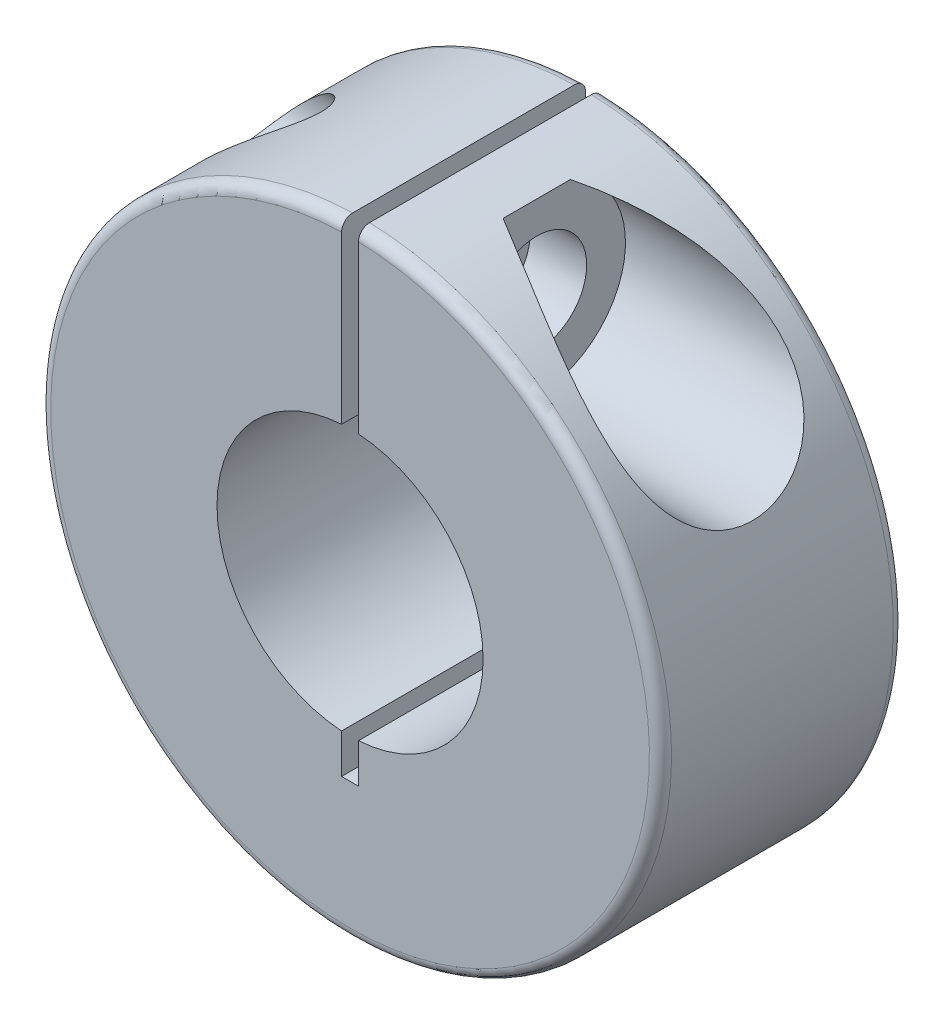
ISO-10303-21;
HEADER;
FILE_DESCRIPTION(('STEP AP214'),'2;1');
FILE_NAME('part.step','',(''),(''),'','','');
FILE_SCHEMA(('AUTOMOTIVE_DESIGN { 1 0 10303 214 1 1 1 1 }'));
ENDSEC;
DATA;
#1=APPLICATION_CONTEXT('core data for automotive mechanical design processes');
#2=APPLICATION_PROTOCOL_DEFINITION('international standard','automotive_design',2000,#1);
#3=PRODUCT_CONTEXT('',#1,'mechanical');
#4=PRODUCT('Part','Part','',(#3));
#5=PRODUCT_RELATED_PRODUCT_CATEGORY('part','',(#4));
#6=PRODUCT_DEFINITION_FORMATION('','',#4);
#7=PRODUCT_DEFINITION_CONTEXT('part definition',#1,'design');
#8=PRODUCT_DEFINITION('design','',#6,#7);
#9=PRODUCT_DEFINITION_SHAPE('','',#8);
#10=(LENGTH_UNIT() NAMED_UNIT(*) SI_UNIT(.MILLI.,.METRE.));
#11=(NAMED_UNIT(*) PLANE_ANGLE_UNIT() SI_UNIT($,.RADIAN.));
#12=(NAMED_UNIT(*) SI_UNIT($,.STERADIAN.) SOLID_ANGLE_UNIT());
#13=UNCERTAINTY_MEASURE_WITH_UNIT(LENGTH_MEASURE(1.E-05),#10,'distance_accuracy_value','');
#14=(GEOMETRIC_REPRESENTATION_CONTEXT(3) GLOBAL_UNCERTAINTY_ASSIGNED_CONTEXT((#13)) GLOBAL_UNIT_ASSIGNED_CONTEXT((#10,
#11,#12)) REPRESENTATION_CONTEXT('',''));
#15=CARTESIAN_POINT('',(0.,0.,0.));
#16=DIRECTION('',(0.,0.,1.));
#17=DIRECTION('',(1.,0.,0.));
#18=AXIS2_PLACEMENT_3D('',#15,#16,#17);
#19=CARTESIAN_POINT('',(-0.380999999999998,0.,11.));
#20=DIRECTION('',(1.,0.,0.));
#21=DIRECTION('',(0.,1.,0.));
#22=AXIS2_PLACEMENT_3D('',#19,#20,#21);
#23=PLANE('',#22);
#24=CARTESIAN_POINT('',(-0.380999999999999,9.99135287469442,5.5));
#25=DIRECTION('',(1.,0.,0.));
#26=DIRECTION('',(0.,1.,0.));
#27=AXIS2_PLACEMENT_3D('',#24,#25,#26);
#28=CIRCLE('',#27,2.25);
#29=CARTESIAN_POINT('',(-0.381,12.2413528746944,5.5));
#30=VERTEX_POINT('',#29);
#31=EDGE_CURVE('E173',#30,#30,#28,.T.);
#32=ORIENTED_EDGE('',*,*,#31,.F.);
#33=EDGE_LOOP('',(#32));
#34=FACE_BOUND('',#33,.T.);
#35=DIRECTION('',(0.,-1.,0.));
#36=VECTOR('',#35,1.);
#37=CARTESIAN_POINT('',(-0.380999999999998,0.,0.));
#38=LINE('',#37,#36);
#39=CARTESIAN_POINT('',(-0.381,13.494622595686,0.));
#40=VERTEX_POINT('',#39);
#41=CARTESIAN_POINT('',(-0.380999999999999,5.98789103107263,0.));
#42=VERTEX_POINT('',#41);
#43=EDGE_CURVE('E303',#40,#42,#38,.T.);
#44=ORIENTED_EDGE('',*,*,#43,.F.);
#45=CARTESIAN_POINT('',(-0.381,13.494622595686,0.));
#46=CARTESIAN_POINT('',(-0.381,13.522770552681,-2.3856480798943E-05));
#47=CARTESIAN_POINT('',(-0.381,13.5509114471738,0.00237360444585897));
#48=CARTESIAN_POINT('',(-0.381,13.6063761358138,0.0118352829833207));
#49=CARTESIAN_POINT('',(-0.381,13.6337005441245,0.0188958956232556));
#50=CARTESIAN_POINT('',(-0.381,13.6867880346548,0.0375130094480029));
#51=CARTESIAN_POINT('',(-0.381,13.7125503533991,0.0490716889260574));
#52=CARTESIAN_POINT('',(-0.381,13.7617641112205,0.076347324012998));
#53=CARTESIAN_POINT('',(-0.381,13.7852159643901,0.0920635326223953));
#54=CARTESIAN_POINT('',(-0.381,13.8291428992548,0.127207897357845));
#55=CARTESIAN_POINT('',(-0.381,13.8496185646073,0.146635323946282));
#56=CARTESIAN_POINT('',(-0.381,13.8870203865819,0.188657592023252));
#57=CARTESIAN_POINT('',(-0.381,13.9039458503896,0.211253050313917));
#58=CARTESIAN_POINT('',(-0.381,13.933757512009,0.258959586324779));
#59=CARTESIAN_POINT('',(-0.381,13.9466443922888,0.284070238062577));
#60=CARTESIAN_POINT('',(-0.381,13.9680112107762,0.336094165218392));
#61=CARTESIAN_POINT('',(-0.381,13.9764937538233,0.36300636449669));
#62=CARTESIAN_POINT('',(-0.381,13.9866962943889,0.40840357405392));
#63=CARTESIAN_POINT('',(-0.381,13.9897388651791,0.426602334307892));
#64=CARTESIAN_POINT('',(-0.381,13.9937978035054,0.463198179154417));
#65=CARTESIAN_POINT('',(-0.381,13.9948170441198,0.48159494518199));
#66=CARTESIAN_POINT('',(-0.381,13.9948147183162,0.500000000000001));
#67=B_SPLINE_CURVE_WITH_KNOTS('',3,(#45,#46,#47,#48,#49,#50,#51,#52,#53,#54,#55,#56,#57,#58,#59,
#60,#61,#62,#63,#64,#65,#66),.UNSPECIFIED.,.F.,.F.,(4,2,2,2,2,2,2,2,2,2,4),(0.,
0.0843318473892852,0.168598576041419,0.25290616369744,0.337198613756395,0.42147451093409,
0.505766839110078,0.59004491528933,0.674273090286936,0.729522423625952,0.784693248012897),.UNSPECIFIED.);
#68=CARTESIAN_POINT('',(-0.381,13.9948147183162,0.5));
#69=VERTEX_POINT('',#68);
#70=EDGE_CURVE('E57',#40,#69,#67,.T.);
#71=ORIENTED_EDGE('',*,*,#70,.T.);
#72=DIRECTION('',(0.,0.,-1.));
#73=VECTOR('',#72,1.);
#74=CARTESIAN_POINT('',(-0.381,13.9948147183162,11.));
#75=LINE('',#74,#73);
#76=CARTESIAN_POINT('',(-0.381,13.9948147183162,10.5));
#77=VERTEX_POINT('',#76);
#78=EDGE_CURVE('E142',#77,#69,#75,.T.);
#79=ORIENTED_EDGE('',*,*,#78,.F.);
#80=CARTESIAN_POINT('',(-0.381,13.9948147183162,10.5));
#81=CARTESIAN_POINT('',(-0.381,13.9948386514708,10.5281215163954));
#82=CARTESIAN_POINT('',(-0.381,13.9924428136574,10.5562358353085));
#83=CARTESIAN_POINT('',(-0.381,13.982988274861,10.6116472803403));
#84=CARTESIAN_POINT('',(-0.381,13.9759332797482,10.6389450379246));
#85=CARTESIAN_POINT('',(-0.381,13.9573321566528,10.6919803664801));
#86=CARTESIAN_POINT('',(-0.381,13.9457838884574,10.7177171871913));
#87=CARTESIAN_POINT('',(-0.381,13.9185346297668,10.7668831129789));
#88=CARTESIAN_POINT('',(-0.381,13.9028343589414,10.7903126170193));
#89=CARTESIAN_POINT('',(-0.381,13.8677218019287,10.8342077726972));
#90=CARTESIAN_POINT('',(-0.381,13.8483089560558,10.8546729766359));
#91=CARTESIAN_POINT('',(-0.381,13.8063196446011,10.8920592888762));
#92=CARTESIAN_POINT('',(-0.381,13.7837425589739,10.9089797009365));
#93=CARTESIAN_POINT('',(-0.381,13.7360587016614,10.9387998362672));
#94=CARTESIAN_POINT('',(-0.381,13.7109505527683,10.9516973547957));
#95=CARTESIAN_POINT('',(-0.381,13.658930736195,10.9730890842303));
#96=CARTESIAN_POINT('',(-0.381,13.632020124919,10.9815858493063));
#97=CARTESIAN_POINT('',(-0.381,13.5865586908168,10.9918303392394));
#98=CARTESIAN_POINT('',(-0.381,13.568293141638,10.9948921157517));
#99=CARTESIAN_POINT('',(-0.381,13.5315618036437,10.9989766818145));
#100=CARTESIAN_POINT('',(-0.381,13.5130963361501,11.0000023617684));
#101=CARTESIAN_POINT('',(-0.381,13.494622595686,11.));
#102=B_SPLINE_CURVE_WITH_KNOTS('',3,(#80,#81,#82,#83,#84,#85,#86,#87,#88,#89,#90,#91,#92,#93,
#94,#95,#96,#97,#98,#99,#100,#101),.UNSPECIFIED.,.F.,.F.,(4,2,2,2,2,2,2,2,2,2,4),(0.,
0.0842523502820881,0.168437767250216,0.252663332169631,0.336874307765749,0.421097988528811,
0.505338196390752,0.58962449120346,0.673861811804595,0.729317253375158,0.784693915015203),.UNSPECIFIED.);
#103=CARTESIAN_POINT('',(-0.381,13.494622595686,11.));
#104=VERTEX_POINT('',#103);
#105=EDGE_CURVE('E64',#77,#104,#102,.T.);
#106=ORIENTED_EDGE('',*,*,#105,.T.);
#107=DIRECTION('',(0.,-1.,0.));
#108=VECTOR('',#107,1.);
#109=CARTESIAN_POINT('',(-0.380999999999998,0.,11.));
#110=LINE('',#109,#108);
#111=CARTESIAN_POINT('',(-0.380999999999999,5.98789103107263,11.));
#112=VERTEX_POINT('',#111);
#113=EDGE_CURVE('E324',#104,#112,#110,.T.);
#114=ORIENTED_EDGE('',*,*,#113,.T.);
#115=DIRECTION('',(0.,0.,-1.));
#116=VECTOR('',#115,1.);
#117=CARTESIAN_POINT('',(-0.380999999999999,5.98789103107263,11.));
#118=LINE('',#117,#116);
#119=EDGE_CURVE('E278',#112,#42,#118,.T.);
#120=ORIENTED_EDGE('',*,*,#119,.T.);
#121=EDGE_LOOP('',(#44,#71,#79,#106,#114,#120));
#122=FACE_BOUND('',#121,.T.);
#123=ADVANCED_FACE('F47',(#34,#122),#23,.T.);
#124=CARTESIAN_POINT('',(0.,0.,11.));
#125=DIRECTION('',(0.,0.,-1.));
#126=DIRECTION('',(-1.,0.,0.));
#127=AXIS2_PLACEMENT_3D('',#124,#125,#126);
#128=CYLINDRICAL_SURFACE('',#127,14.);
#129=CARTESIAN_POINT('',(-9.80677662299574,9.99135287469442,3.25000000000001));
#130=CARTESIAN_POINT('',(-9.71144092218553,10.0849282767981,3.249999747448));
#131=CARTESIAN_POINT('',(-9.61477819678854,10.1771192897609,3.255829056343));
#132=CARTESIAN_POINT('',(-9.41952520384349,10.358101528461,3.27821896220465));
#133=CARTESIAN_POINT('',(-9.32093462528083,10.4468921986806,3.29478130478408));
#134=CARTESIAN_POINT('',(-9.1220386547493,10.6210155537334,3.33803002973555));
#135=CARTESIAN_POINT('',(-9.0217271230376,10.7063285461885,3.36476703647294));
#136=CARTESIAN_POINT('',(-8.82059747223025,10.8726300254909,3.42786122717365));
#137=CARTESIAN_POINT('',(-8.719779479428,10.9536195370746,3.46421611926338));
#138=CARTESIAN_POINT('',(-8.51600682083762,11.1128183138806,3.54729231374669));
#139=CARTESIAN_POINT('',(-8.41305733653692,11.190918236494,3.59423620218023));
#140=CARTESIAN_POINT('',(-8.20829106463661,11.3419638988025,3.69812298332746));
#141=CARTESIAN_POINT('',(-8.10647501156209,11.4149064433946,3.75507199960946));
#142=CARTESIAN_POINT('',(-7.90596196405012,11.5546791569539,3.8791370090942));
#143=CARTESIAN_POINT('',(-7.8072499517535,11.6215432884125,3.94619012804282));
#144=CARTESIAN_POINT('',(-7.61435183321916,11.7488268105953,4.09176155624011));
#145=CARTESIAN_POINT('',(-7.52015887369976,11.809256141328,4.17026172499334));
#146=CARTESIAN_POINT('',(-7.36856112152079,11.9041824072689,4.31324726874244));
#147=CARTESIAN_POINT('',(-7.30906853053722,11.9407685385866,4.37411892549487));
#148=CARTESIAN_POINT('',(-7.19524022444199,12.0097017598975,4.50294808091081));
#149=CARTESIAN_POINT('',(-7.14091003050846,12.0420443251678,4.57091300642646));
#150=CARTESIAN_POINT('',(-7.03943728326863,12.101645334851,4.7155485687279));
#151=CARTESIAN_POINT('',(-6.99238710730597,12.1288392844685,4.79231246800148));
#152=CARTESIAN_POINT('',(-6.91038336281861,12.1757482082072,4.95415707934238));
#153=CARTESIAN_POINT('',(-6.87539068673797,12.1954873817054,5.03920973364243));
#154=CARTESIAN_POINT('',(-6.83087419386879,12.2204580017324,5.18800710546424));
#155=CARTESIAN_POINT('',(-6.81679080883492,12.2283062362265,5.24993632998685));
#156=CARTESIAN_POINT('',(-6.79794427713952,12.2387938887602,5.37562126824922));
#157=CARTESIAN_POINT('',(-6.79317137860872,12.2414387568673,5.43937499986858));
#158=CARTESIAN_POINT('',(-6.79348884722361,12.2412625627841,5.56693985739305));
#159=CARTESIAN_POINT('',(-6.79859324868041,12.2384337231936,5.63075093600876));
#160=CARTESIAN_POINT('',(-6.81809462346059,12.2275796705216,5.75648618692533));
#161=CARTESIAN_POINT('',(-6.83250076268622,12.2195493318749,5.81840843488066));
#162=CARTESIAN_POINT('',(-6.87485412079646,12.1957831069151,5.95759106922469));
#163=CARTESIAN_POINT('',(-6.90560320794992,12.1784369789189,6.03371193857257));
#164=CARTESIAN_POINT('',(-6.97700130895304,12.1376747960357,6.17938012281175));
#165=CARTESIAN_POINT('',(-7.017673231754,12.1142446868307,6.24891170163788));
#166=CARTESIAN_POINT('',(-7.13414745264063,12.0461976786497,6.4239964312265));
#167=CARTESIAN_POINT('',(-7.21576251919335,11.9976241633134,6.52408744198064));
#168=CARTESIAN_POINT('',(-7.38921488154059,11.8915917241215,6.7095594920909));
#169=CARTESIAN_POINT('',(-7.48108089425436,11.8341076539041,6.79489740887436));
#170=CARTESIAN_POINT('',(-7.65951347789753,11.7192906292928,6.94377009013503));
#171=CARTESIAN_POINT('',(-7.74543897513523,11.6627298116876,7.00868803058494));
#172=CARTESIAN_POINT('',(-7.92013301342465,11.5448089265316,7.12985497524375));
#173=CARTESIAN_POINT('',(-8.00890354000798,11.4834454621867,7.18609775866071));
#174=CARTESIAN_POINT('',(-8.18816002250651,11.3563253767639,7.29056430009206));
#175=CARTESIAN_POINT('',(-8.27864775884964,11.2905639950318,7.33877916447505));
#176=CARTESIAN_POINT('',(-8.460382680831,11.1550337902025,7.42740761007823));
#177=CARTESIAN_POINT('',(-8.55162967423271,11.085265956594,7.46782310687759));
#178=CARTESIAN_POINT('',(-8.73933842742459,10.937959552211,7.54294973964954));
#179=CARTESIAN_POINT('',(-8.83580828343562,10.860204606688,7.57721925545305));
#180=CARTESIAN_POINT('',(-9.02822229001283,10.7007882203718,7.63692477403324));
#181=CARTESIAN_POINT('',(-9.12416635626895,10.6191261723907,7.66235939870682));
#182=CARTESIAN_POINT('',(-9.41007259918566,10.368908522672,7.7247450762885));
#183=CARTESIAN_POINT('',(-9.59853440431632,10.1947891881169,7.74794930778466));
#184=CARTESIAN_POINT('',(-9.92672458528155,9.87426957056963,7.7513837301189));
#185=CARTESIAN_POINT('',(-10.0683076934838,9.72982811741549,7.73968845470281));
#186=CARTESIAN_POINT('',(-10.3424397368736,9.43788927318152,7.6858955871941));
#187=CARTESIAN_POINT('',(-10.4749995974856,9.29039587026954,7.6438355043217));
#188=CARTESIAN_POINT('',(-10.6987114826472,9.03106073764244,7.53844979793506));
#189=CARTESIAN_POINT('',(-10.7924680276699,8.91866659141784,7.48204129488734));
#190=CARTESIAN_POINT('',(-10.9698570246067,8.69954014401372,7.34668493596707));
#191=CARTESIAN_POINT('',(-11.0535022806534,8.59280078041491,7.26776602037102));
#192=CARTESIAN_POINT('',(-11.1940670676537,8.40855670251984,7.10301442713889));
#193=CARTESIAN_POINT('',(-11.2530857584512,8.32925179065699,7.0209973047614));
#194=CARTESIAN_POINT('',(-11.3609684491639,8.18148872267133,6.84177362773254));
#195=CARTESIAN_POINT('',(-11.4098350782028,8.11302775933745,6.74457101718659));
#196=CARTESIAN_POINT('',(-11.4961233338991,7.99029705079579,6.53586843842917));
#197=CARTESIAN_POINT('',(-11.5334632520046,7.93612899834819,6.42427400653758));
#198=CARTESIAN_POINT('',(-11.5947920729691,7.84626009725168,6.19045199366057));
#199=CARTESIAN_POINT('',(-11.6187900858531,7.81054664873944,6.06823173422903));
#200=CARTESIAN_POINT('',(-11.6503856953993,7.76332485887685,5.83311309408001));
#201=CARTESIAN_POINT('',(-11.6596400582382,7.74937580685407,5.720922303343));
#202=CARTESIAN_POINT('',(-11.6668412672818,7.73853138029522,5.49537818478841));
#203=CARTESIAN_POINT('',(-11.6647932158554,7.74162831050868,5.38202540460494));
#204=CARTESIAN_POINT('',(-11.6499529347657,7.7639389150591,5.16489776306207));
#205=CARTESIAN_POINT('',(-11.6378424173281,7.78212989345928,5.0609679891665));
#206=CARTESIAN_POINT('',(-11.604122603695,7.83232052910018,4.85813173802071));
#207=CARTESIAN_POINT('',(-11.5825134335432,7.86432000310731,4.75922519413355));
#208=CARTESIAN_POINT('',(-11.5297860952768,7.94142613370999,4.56655430058456));
#209=CARTESIAN_POINT('',(-11.4984577711236,7.98682126330818,4.47296383555739));
#210=CARTESIAN_POINT('',(-11.4273204926325,8.0882741023787,4.29531461019636));
#211=CARTESIAN_POINT('',(-11.3875094902061,8.14433438653365,4.21125815931307));
#212=CARTESIAN_POINT('',(-11.2961055824576,8.2707091639048,4.04613746030606));
#213=CARTESIAN_POINT('',(-11.2437437943724,8.34187935968289,3.96615729713809));
#214=CARTESIAN_POINT('',(-11.1312229973,8.49144654804438,3.81959214532074));
#215=CARTESIAN_POINT('',(-11.0710582136087,8.56984888032726,3.75301717142802));
#216=CARTESIAN_POINT('',(-10.9162823630896,8.76678300528018,3.60689640748904));
#217=CARTESIAN_POINT('',(-10.8181361647345,8.88783471469506,3.53446643965392));
#218=CARTESIAN_POINT('',(-10.6114428442822,9.13362870394798,3.41540656377434));
#219=CARTESIAN_POINT('',(-10.5028813043953,9.25837592949429,3.36881304325928));
#220=CARTESIAN_POINT('',(-10.2976065819893,9.48570372823707,3.30495204285344));
#221=CARTESIAN_POINT('',(-10.2020981451046,9.58838118374494,3.28400290064725));
#222=CARTESIAN_POINT('',(-10.0071451448017,9.79167262636888,3.25653405440741));
#223=CARTESIAN_POINT('',(-9.90770451970442,9.89228853218965,3.25000026736619));
#224=CARTESIAN_POINT('',(-9.80677662299574,9.99135287469442,3.25000000000001));
#225=B_SPLINE_CURVE_WITH_KNOTS('',3,(#129,#130,#131,#132,#133,#134,#135,#136,#137,#138,#139,
#140,#141,#142,#143,#144,#145,#146,#147,#148,#149,#150,#151,#152,#153,#154,#155,#156,#157,#158,
#159,#160,#161,#162,#163,#164,#165,#166,#167,#168,#169,#170,#171,#172,#173,#174,#175,#176,#177,
#178,#179,#180,#181,#182,#183,#184,#185,#186,#187,#188,#189,#190,#191,#192,#193,#194,#195,#196,
#197,#198,#199,#200,#201,#202,#203,#204,#205,#206,#207,#208,#209,#210,#211,#212,#213,#214,#215,
#216,#217,#218,#219,#220,#221,#222,#223,#224),.UNSPECIFIED.,.T.,.F.,(4,2,2,2,2,2,2,2,2,2,2,2,2,
2,2,2,2,2,2,2,2,2,2,2,2,2,2,2,2,2,2,2,2,2,2,2,2,2,2,2,2,2,2,2,2,2,2,4),(0.,0.400601973616465,
0.801269117203906,1.20395642455656,1.60654786068814,2.01855615103448,2.43081749227533,
2.84061202052463,3.24976405347713,3.52731178013838,3.80515307924544,4.08627284821139,
4.3664720498737,4.55764871006394,4.74862502272577,4.93987288622684,5.13130949295726,
5.38162008614468,5.63251413534603,6.04414981913638,6.45696906566407,6.82139797822443,
7.18608701302509,7.55117741400893,7.91617803179751,8.30145546088611,8.68679296019291,
9.45578512777883,10.0615901479816,10.6666481034216,11.1355216243602,11.6037950391726,
11.9875924226007,12.3712902880959,12.7576486949805,13.1437429663359,13.4822526582611,
13.8206095456652,14.1377514326652,14.45488911144,14.7794283263339,15.1040459881202,
15.4602012195812,15.8166215484674,16.3293505491723,16.8427998447399,17.2673152173359,
17.6914156778229),.UNSPECIFIED.);
#226=CARTESIAN_POINT('',(-9.80677662299574,9.99135287469442,3.25000000000001));
#227=VERTEX_POINT('',#226);
#228=EDGE_CURVE('E165',#227,#227,#225,.T.);
#229=ORIENTED_EDGE('',*,*,#228,.T.);
#230=EDGE_LOOP('',(#229));
#231=FACE_BOUND('',#230,.T.);
#232=CARTESIAN_POINT('',(2.921,13.691886612151,3.98143157613972));
#233=CARTESIAN_POINT('',(3.10052121387106,13.6535862056869,3.88812644382007));
#234=CARTESIAN_POINT('',(3.27984906520364,13.6116389370431,3.79593013534254));
#235=CARTESIAN_POINT('',(3.63794966358267,13.5203359405854,3.61409062276887));
#236=CARTESIAN_POINT('',(3.81672231427397,13.4709789929532,3.52444784194345));
#237=CARTESIAN_POINT('',(4.17402331938509,13.3645941239546,3.34781562371714));
#238=CARTESIAN_POINT('',(4.35254930719515,13.3075434955533,3.26083501302643));
#239=CARTESIAN_POINT('',(4.70859231525838,13.1857709912881,3.09029696672421));
#240=CARTESIAN_POINT('',(4.88610938309882,13.1210494804333,3.00673936848742));
#241=CARTESIAN_POINT('',(5.42147553224615,12.9133818615029,2.7598469825603));
#242=CARTESIAN_POINT('',(5.77753591387651,12.7582907055454,2.60259066090503));
#243=CARTESIAN_POINT('',(6.4821959514539,12.415087597565,2.30996993143449));
#244=CARTESIAN_POINT('',(6.8308056142673,12.2270235261772,2.17457431952588));
#245=CARTESIAN_POINT('',(7.35822836560734,11.9122773301845,1.98912546834973));
#246=CARTESIAN_POINT('',(7.54065923691582,11.7976869750873,1.92865330250456));
#247=CARTESIAN_POINT('',(7.90210986821128,11.5587014949983,1.81750186173246));
#248=CARTESIAN_POINT('',(8.08112955781253,11.4343061679637,1.7668227886777));
#249=CARTESIAN_POINT('',(8.43443749622847,11.1762233565544,1.67708414623677));
#250=CARTESIAN_POINT('',(8.60873931408202,11.042567620233,1.63798708662113));
#251=CARTESIAN_POINT('',(8.95233218384306,10.7658887180851,1.57313399583714));
#252=CARTESIAN_POINT('',(9.1216243231104,10.6228676070066,1.54737504928213));
#253=CARTESIAN_POINT('',(9.41991299860896,10.3583972760682,1.51513067773033));
#254=CARTESIAN_POINT('',(9.55003300400482,10.238565045288,1.50576997511786));
#255=CARTESIAN_POINT('',(9.80579292761796,9.99388420127245,1.49812921327587));
#256=CARTESIAN_POINT('',(9.931433935278,9.86903682382064,1.49984644077388));
#257=CARTESIAN_POINT('',(10.1774343930373,9.6151468791865,1.51570143162625));
#258=CARTESIAN_POINT('',(10.2977977068076,9.48610750554822,1.52982994403375));
#259=CARTESIAN_POINT('',(10.5324911932182,9.2248268473834,1.57190458026732));
#260=CARTESIAN_POINT('',(10.6468230974618,9.09258649793083,1.5998467140788));
#261=CARTESIAN_POINT('',(10.8416147439922,8.85870292615582,1.66229404751643));
#262=CARTESIAN_POINT('',(10.923559149014,8.75742563570951,1.69355903209034));
#263=CARTESIAN_POINT('',(11.0830400760213,8.55469701158849,1.7653544481766));
#264=CARTESIAN_POINT('',(11.1605776617056,8.45324572605487,1.80588263181661));
#265=CARTESIAN_POINT('',(11.3108459349825,8.2510986653684,1.89669680840774));
#266=CARTESIAN_POINT('',(11.3835757001539,8.15040303846131,1.94698466659317));
#267=CARTESIAN_POINT('',(11.5237581646278,7.95096507773547,2.05764413639944));
#268=CARTESIAN_POINT('',(11.5912135385923,7.8522217731188,2.11801058779339));
#269=CARTESIAN_POINT('',(11.721124922188,7.65696507765743,2.24967232826229));
#270=CARTESIAN_POINT('',(11.7835261567005,7.56048256463382,2.32106784570312));
#271=CARTESIAN_POINT('',(11.9022113302132,7.37222782917436,2.47429300953538));
#272=CARTESIAN_POINT('',(11.9584984189115,7.28045319446163,2.55611723591387));
#273=CARTESIAN_POINT('',(12.06469427793,7.10308644807848,2.72992276158386));
#274=CARTESIAN_POINT('',(12.1146052083012,7.01749224695785,2.82190060134658));
#275=CARTESIAN_POINT('',(12.2078686817104,6.85396275507001,3.01548239696001));
#276=CARTESIAN_POINT('',(12.2512224568547,6.77602602641074,3.11708453852996));
#277=CARTESIAN_POINT('',(12.3254287425185,6.63994811879418,3.31362812357258));
#278=CARTESIAN_POINT('',(12.3571823439165,6.58057738500829,3.40738177391438));
#279=CARTESIAN_POINT('',(12.4158063025014,6.46928979937595,3.6006576259751));
#280=CARTESIAN_POINT('',(12.4426772882657,6.4173719882373,3.70017908298018));
#281=CARTESIAN_POINT('',(12.491538001309,6.32173739551869,3.90418965135019));
#282=CARTESIAN_POINT('',(12.5135295020801,6.2780176351823,4.00867694101835));
#283=CARTESIAN_POINT('',(12.5526746588171,6.19937828569012,4.22178801167349));
#284=CARTESIAN_POINT('',(12.5698285867577,6.1644582018167,4.33041155972469));
#285=CARTESIAN_POINT('',(12.5979932796696,6.10667671790864,4.5407898784673));
#286=CARTESIAN_POINT('',(12.6094216421612,6.08300597796911,4.64226753526365));
#287=CARTESIAN_POINT('',(12.6283513403605,6.04360999208996,4.84715198715318));
#288=CARTESIAN_POINT('',(12.6358514125556,6.02788730265297,4.95055939187695));
#289=CARTESIAN_POINT('',(12.6469381500037,6.00459174448204,5.15843253528871));
#290=CARTESIAN_POINT('',(12.6505271532361,5.99701400685286,5.26289760397964));
#291=CARTESIAN_POINT('',(12.6538125378499,5.99007875163632,5.47220071462953));
#292=CARTESIAN_POINT('',(12.6535074977567,5.99072423583891,5.57703887882081));
#293=CARTESIAN_POINT('',(12.6490620680933,6.00010448658045,5.78339107562564));
#294=CARTESIAN_POINT('',(12.645026881113,6.00861736472894,5.88491755332629));
#295=CARTESIAN_POINT('',(12.6332550238189,6.0333286547589,6.08685140740019));
#296=CARTESIAN_POINT('',(12.6255170273787,6.04952982011073,6.18725836963576));
#297=CARTESIAN_POINT('',(12.6063210442852,6.08943008666778,6.38616184074493));
#298=CARTESIAN_POINT('',(12.5948647044865,6.11312586838829,6.48465917496425));
#299=CARTESIAN_POINT('',(12.5681983493446,6.16776407289262,6.67914147652232));
#300=CARTESIAN_POINT('',(12.5529869464301,6.19870917422954,6.77512550060798));
#301=CARTESIAN_POINT('',(12.5187511256974,6.26756332572205,6.964077165294));
#302=CARTESIAN_POINT('',(12.4997193533199,6.30548579601726,7.05703857971985));
#303=CARTESIAN_POINT('',(12.4578313945536,6.38784555033323,7.23917452228777));
#304=CARTESIAN_POINT('',(12.4349738303224,6.43228518076459,7.32834767154317));
#305=CARTESIAN_POINT('',(12.3854379433208,6.52715768491282,7.50228915121409));
#306=CARTESIAN_POINT('',(12.3587610567848,6.57758830454425,7.58705912116295));
#307=CARTESIAN_POINT('',(12.3015791377807,6.68392071554833,7.75177880262082));
#308=CARTESIAN_POINT('',(12.2710726789563,6.73982454374691,7.83172670159754));
#309=CARTESIAN_POINT('',(12.2052788119131,6.85827169890472,7.98872658588863));
#310=CARTESIAN_POINT('',(12.1698740183038,6.9209654652806,8.06561602046869));
#311=CARTESIAN_POINT('',(12.0951028593616,7.0508238667679,8.21348275065844));
#312=CARTESIAN_POINT('',(12.0557350559855,7.11799012178071,8.2844578829671));
#313=CARTESIAN_POINT('',(11.9318330371199,7.32510271922409,8.48806037917611));
#314=CARTESIAN_POINT('',(11.8414496469456,7.47075562312911,8.61148584970089));
#315=CARTESIAN_POINT('',(11.6383941796003,7.78365837310316,8.84169170932747));
#316=CARTESIAN_POINT('',(11.5245055507181,7.95170080073944,8.94629388631905));
#317=CARTESIAN_POINT('',(11.2817555868813,8.29251210446594,9.12644754024475));
#318=CARTESIAN_POINT('',(11.1528854396671,8.46528371616029,9.20198180544797));
#319=CARTESIAN_POINT('',(10.9189585066493,8.76367807578328,9.30929777663115));
#320=CARTESIAN_POINT('',(10.8168646935865,8.88943803641522,9.34738609253976));
#321=CARTESIAN_POINT('',(10.6066214404176,9.13926801396791,9.41031235324607));
#322=CARTESIAN_POINT('',(10.4984698293546,9.26333740497142,9.43514551373459));
#323=CARTESIAN_POINT('',(10.2767527964419,9.50871961999024,9.47271954068511));
#324=CARTESIAN_POINT('',(10.1631796759611,9.63002813965037,9.485442639794));
#325=CARTESIAN_POINT('',(9.93142804114359,9.8688626161783,9.49991414967632));
#326=CARTESIAN_POINT('',(9.81324818272918,9.98638745056472,9.50165933301246));
#327=CARTESIAN_POINT('',(9.52227298776818,10.2655881052704,9.49395567728674));
#328=CARTESIAN_POINT('',(9.34743892207874,10.4250114193003,9.47948256108455));
#329=CARTESIAN_POINT('',(8.9912079576387,10.7337699888785,9.43359813257394));
#330=CARTESIAN_POINT('',(8.80980832738148,10.8831009698282,9.40217969305934));
#331=CARTESIAN_POINT('',(8.44139309152326,11.171287476443,9.32492395935049));
#332=CARTESIAN_POINT('',(8.25436885147662,11.3101256124336,9.27906335309912));
#333=CARTESIAN_POINT('',(7.87599021239244,11.5768033311664,9.1751628065013));
#334=CARTESIAN_POINT('',(7.68463592856355,11.7046432061037,9.11712318986032));
#335=CARTESIAN_POINT('',(7.20084418459043,12.0110851779176,8.95884953655929));
#336=CARTESIAN_POINT('',(6.90612412747678,12.1827501989421,8.85210251013249));
#337=CARTESIAN_POINT('',(6.31057938596893,12.5016324825669,8.62047302500042));
#338=CARTESIAN_POINT('',(6.00975121553654,12.648835317318,8.49557994452548));
#339=CARTESIAN_POINT('',(5.40363505943594,12.919399149264,8.23171164478036));
#340=CARTESIAN_POINT('',(5.09834686773497,13.0427590412533,8.09273577317735));
#341=CARTESIAN_POINT('',(4.4846538222275,13.266290690941,7.80393368908513));
#342=CARTESIAN_POINT('',(4.17625051505285,13.3664734171322,7.65411265327785));
#343=CARTESIAN_POINT('',(3.70941092063181,13.5006326378,7.42175275214746));
#344=CARTESIAN_POINT('',(3.55176112934018,13.5429494756758,7.34233396572158));
#345=CARTESIAN_POINT('',(3.23646006946635,13.6217344578422,7.18175307803313));
#346=CARTESIAN_POINT('',(3.07880999377583,13.6582183440356,7.10059636295836));
#347=CARTESIAN_POINT('',(2.92099999999997,13.691886612151,7.01856842386035));
#348=B_SPLINE_CURVE_WITH_KNOTS('',3,(#232,#233,#234,#235,#236,#237,#238,#239,#240,#241,#242,
#243,#244,#245,#246,#247,#248,#249,#250,#251,#252,#253,#254,#255,#256,#257,#258,#259,#260,#261,
#262,#263,#264,#265,#266,#267,#268,#269,#270,#271,#272,#273,#274,#275,#276,#277,#278,#279,#280,
#281,#282,#283,#284,#285,#286,#287,#288,#289,#290,#291,#292,#293,#294,#295,#296,#297,#298,#299,
#300,#301,#302,#303,#304,#305,#306,#307,#308,#309,#310,#311,#312,#313,#314,#315,#316,#317,#318,
#319,#320,#321,#322,#323,#324,#325,#326,#327,#328,#329,#330,#331,#332,#333,#334,#335,#336,#337,
#338,#339,#340,#341,#342,#343,#344,#345,#346,#347),.UNSPECIFIED.,.F.,.F.,(4,2,2,2,2,2,2,2,2,2,2,
2,2,2,2,2,2,2,2,2,2,2,2,2,2,2,2,2,2,2,2,2,2,2,2,2,2,2,2,2,2,2,2,2,2,2,2,2,2,2,2,2,2,2,2,2,2,4),
(0.,0.617716801215495,1.23553540578581,1.85521905575775,2.47487323070459,3.73009507167484,
4.98350905220073,5.65441448280351,6.32533374179424,6.99405693375195,7.66263389734196,
8.19363529792671,8.72450664743229,9.25498263903348,9.78530549401073,10.1868801202375,
10.58835740084,10.989911486047,11.3912606030437,11.7964986327204,12.2015269042423,
12.6064175984107,13.0112321178028,13.3570405261653,13.7028043843107,14.0484423649026,
14.3940609093967,14.7081569988794,15.0223540536693,15.3363631828782,15.6504869406922,
15.9560130852536,16.2616487331125,16.5671491992091,16.8727627232929,17.1789703229516,
17.4852884401869,17.7914916693273,18.0978092867023,18.4134638300242,18.7292333295094,
19.3602958353583,20.0428210880918,20.7257498590363,21.2243185000262,21.7230669726551,
22.2225460644356,22.722171993026,23.4322302199275,24.1425873306174,24.8540970043847,
25.5655877693576,26.636105464312,27.7072523290031,28.7784488332812,29.8491373567285,
30.3936271671418,30.9366217619112),.UNSPECIFIED.);
#349=CARTESIAN_POINT('',(2.921,13.691886612151,3.98143157613972));
#350=VERTEX_POINT('',#349);
#351=CARTESIAN_POINT('',(2.921,13.691886612151,7.01856842386028));
#352=VERTEX_POINT('',#351);
#353=EDGE_CURVE('E133',#350,#352,#348,.T.);
#354=ORIENTED_EDGE('',*,*,#353,.T.);
#355=DIRECTION('',(0.,0.,-1.));
#356=VECTOR('',#355,1.);
#357=CARTESIAN_POINT('',(2.921,13.691886612151,11.));
#358=LINE('',#357,#356);
#359=EDGE_CURVE('E141',#352,#350,#358,.T.);
#360=ORIENTED_EDGE('',*,*,#359,.T.);
#361=EDGE_LOOP('',(#354,#360));
#362=FACE_BOUND('',#361,.T.);
#363=ORIENTED_EDGE('',*,*,#78,.T.);
#364=CARTESIAN_POINT('',(0.,0.,0.5));
#365=DIRECTION('',(0.,0.,1.));
#366=DIRECTION('',(1.,0.,0.));
#367=AXIS2_PLACEMENT_3D('',#364,#365,#366);
#368=CIRCLE('',#367,14.);
#369=CARTESIAN_POINT('',(0.381,13.9948147183162,0.5));
#370=VERTEX_POINT('',#369);
#371=EDGE_CURVE('E155',#69,#370,#368,.T.);
#372=ORIENTED_EDGE('',*,*,#371,.T.);
#373=DIRECTION('',(0.,0.,-1.));
#374=VECTOR('',#373,1.);
#375=CARTESIAN_POINT('',(0.381,13.9948147183162,11.));
#376=LINE('',#375,#374);
#377=CARTESIAN_POINT('',(0.381,13.9948147183162,10.5));
#378=VERTEX_POINT('',#377);
#379=EDGE_CURVE('E253',#378,#370,#376,.T.);
#380=ORIENTED_EDGE('',*,*,#379,.F.);
#381=CARTESIAN_POINT('',(0.,0.,10.5));
#382=DIRECTION('',(0.,0.,1.));
#383=DIRECTION('',(1.,0.,0.));
#384=AXIS2_PLACEMENT_3D('',#381,#382,#383);
#385=CIRCLE('',#384,14.);
#386=EDGE_CURVE('E152',#378,#77,#385,.F.);
#387=ORIENTED_EDGE('',*,*,#386,.T.);
#388=EDGE_LOOP('',(#363,#372,#380,#387));
#389=FACE_BOUND('',#388,.T.);
#390=ADVANCED_FACE('F149',(#231,#362,#389),#128,.T.);
#391=CARTESIAN_POINT('',(0.380999999999998,0.,11.));
#392=DIRECTION('',(1.,0.,0.));
#393=DIRECTION('',(0.,1.,0.));
#394=AXIS2_PLACEMENT_3D('',#391,#392,#393);
#395=PLANE('',#394);
#396=CARTESIAN_POINT('',(0.380999999999999,9.99135287469442,5.5));
#397=DIRECTION('',(1.,0.,0.));
#398=DIRECTION('',(0.,1.,0.));
#399=AXIS2_PLACEMENT_3D('',#396,#397,#398);
#400=CIRCLE('',#399,2.25);
#401=CARTESIAN_POINT('',(0.381,12.2413528746944,5.5));
#402=VERTEX_POINT('',#401);
#403=EDGE_CURVE('E174',#402,#402,#400,.T.);
#404=ORIENTED_EDGE('',*,*,#403,.T.);
#405=EDGE_LOOP('',(#404));
#406=FACE_BOUND('',#405,.T.);
#407=ORIENTED_EDGE('',*,*,#379,.T.);
#408=CARTESIAN_POINT('',(0.381,13.9948147183162,0.5));
#409=CARTESIAN_POINT('',(0.381,13.9948386514708,0.471878483604646));
#410=CARTESIAN_POINT('',(0.381,13.9924428136574,0.443764164691529));
#411=CARTESIAN_POINT('',(0.381,13.982988274861,0.388352719659715));
#412=CARTESIAN_POINT('',(0.381,13.9759332797482,0.361054962075431));
#413=CARTESIAN_POINT('',(0.381,13.9573321566528,0.308019633519891));
#414=CARTESIAN_POINT('',(0.381,13.9457838884574,0.282282812808662));
#415=CARTESIAN_POINT('',(0.381,13.9185346297668,0.233116887021083));
#416=CARTESIAN_POINT('',(0.381,13.9028343589414,0.20968738298072));
#417=CARTESIAN_POINT('',(0.381,13.8677218019287,0.165792227302839));
#418=CARTESIAN_POINT('',(0.381,13.8483089560558,0.145327023364098));
#419=CARTESIAN_POINT('',(0.381,13.8063196446011,0.107940711123846));
#420=CARTESIAN_POINT('',(0.381,13.7837425589739,0.0910202990634518));
#421=CARTESIAN_POINT('',(0.381,13.7360587016614,0.0612001637327593));
#422=CARTESIAN_POINT('',(0.381,13.7109505527683,0.0483026452043197));
#423=CARTESIAN_POINT('',(0.381,13.658930736195,0.0269109157696586));
#424=CARTESIAN_POINT('',(0.381,13.632020124919,0.0184141506936953));
#425=CARTESIAN_POINT('',(0.381,13.5865586908168,0.00816966076064015));
#426=CARTESIAN_POINT('',(0.381,13.568293141638,0.00510788424830547));
#427=CARTESIAN_POINT('',(0.381,13.5315618036437,0.00102331818546778));
#428=CARTESIAN_POINT('',(0.381,13.5130963361501,-2.36176837423396E-06));
#429=CARTESIAN_POINT('',(0.381,13.494622595686,0.));
#430=B_SPLINE_CURVE_WITH_KNOTS('',3,(#408,#409,#410,#411,#412,#413,#414,#415,#416,#417,#418,
#419,#420,#421,#422,#423,#424,#425,#426,#427,#428,#429),.UNSPECIFIED.,.F.,.F.,(4,2,2,2,2,2,2,2,
2,2,4),(0.,0.0842523502820886,0.168437767250216,0.252663332169629,0.336874307765749,
0.421097988528812,0.505338196390752,0.589624491203461,0.673861811804597,0.72931725337516,
0.784693915015201),.UNSPECIFIED.);
#431=CARTESIAN_POINT('',(0.381,13.494622595686,0.));
#432=VERTEX_POINT('',#431);
#433=EDGE_CURVE('E222',#370,#432,#430,.T.);
#434=ORIENTED_EDGE('',*,*,#433,.T.);
#435=DIRECTION('',(0.,-1.,0.));
#436=VECTOR('',#435,1.);
#437=CARTESIAN_POINT('',(0.380999999999998,0.,0.));
#438=LINE('',#437,#436);
#439=CARTESIAN_POINT('',(0.380999999999999,5.98789103107263,0.));
#440=VERTEX_POINT('',#439);
#441=EDGE_CURVE('E300',#432,#440,#438,.T.);
#442=ORIENTED_EDGE('',*,*,#441,.T.);
#443=DIRECTION('',(0.,0.,-1.));
#444=VECTOR('',#443,1.);
#445=CARTESIAN_POINT('',(0.380999999999999,5.98789103107263,11.));
#446=LINE('',#445,#444);
#447=CARTESIAN_POINT('',(0.380999999999999,5.98789103107263,11.));
#448=VERTEX_POINT('',#447);
#449=EDGE_CURVE('E259',#448,#440,#446,.T.);
#450=ORIENTED_EDGE('',*,*,#449,.F.);
#451=DIRECTION('',(0.,-1.,0.));
#452=VECTOR('',#451,1.);
#453=CARTESIAN_POINT('',(0.380999999999998,0.,11.));
#454=LINE('',#453,#452);
#455=CARTESIAN_POINT('',(0.381,13.494622595686,11.));
#456=VERTEX_POINT('',#455);
#457=EDGE_CURVE('E321',#456,#448,#454,.T.);
#458=ORIENTED_EDGE('',*,*,#457,.F.);
#459=CARTESIAN_POINT('',(0.381,13.494622595686,11.));
#460=CARTESIAN_POINT('',(0.381,13.522770552681,11.0000238564808));
#461=CARTESIAN_POINT('',(0.381,13.5509114471738,10.9976263955541));
#462=CARTESIAN_POINT('',(0.381,13.6063761358138,10.9881647170167));
#463=CARTESIAN_POINT('',(0.381,13.6337005441245,10.9811041043767));
#464=CARTESIAN_POINT('',(0.381,13.6867880346548,10.962486990552));
#465=CARTESIAN_POINT('',(0.381,13.7125503533991,10.9509283110739));
#466=CARTESIAN_POINT('',(0.381,13.7617641112205,10.923652675987));
#467=CARTESIAN_POINT('',(0.381,13.7852159643901,10.9079364673776));
#468=CARTESIAN_POINT('',(0.381,13.8291428992548,10.8727921026422));
#469=CARTESIAN_POINT('',(0.381,13.8496185646073,10.8533646760537));
#470=CARTESIAN_POINT('',(0.381,13.8870203865819,10.8113424079767));
#471=CARTESIAN_POINT('',(0.381,13.9039458503896,10.7887469496861));
#472=CARTESIAN_POINT('',(0.381,13.933757512009,10.7410404136752));
#473=CARTESIAN_POINT('',(0.381,13.9466443922888,10.7159297619374));
#474=CARTESIAN_POINT('',(0.381,13.9680112107762,10.6639058347816));
#475=CARTESIAN_POINT('',(0.381,13.9764937538233,10.6369936355033));
#476=CARTESIAN_POINT('',(0.381,13.9866962943889,10.5915964259461));
#477=CARTESIAN_POINT('',(0.381,13.9897388651791,10.5733976656921));
#478=CARTESIAN_POINT('',(0.381,13.9937978035054,10.5368018208456));
#479=CARTESIAN_POINT('',(0.381,13.9948170441198,10.518405054818));
#480=CARTESIAN_POINT('',(0.381,13.9948147183162,10.5));
#481=B_SPLINE_CURVE_WITH_KNOTS('',3,(#459,#460,#461,#462,#463,#464,#465,#466,#467,#468,#469,
#470,#471,#472,#473,#474,#475,#476,#477,#478,#479,#480),.UNSPECIFIED.,.F.,.F.,(4,2,2,2,2,2,2,2,
2,2,4),(0.,0.0843318473892887,0.168598576041418,0.25290616369744,0.337198613756396,
0.42147451093409,0.505766839110077,0.590044915289328,0.674273090286934,0.729522423625948,
0.784693248012894),.UNSPECIFIED.);
#482=EDGE_CURVE('E215',#456,#378,#481,.T.);
#483=ORIENTED_EDGE('',*,*,#482,.T.);
#484=EDGE_LOOP('',(#407,#434,#442,#450,#458,#483));
#485=FACE_BOUND('',#484,.T.);
#486=ADVANCED_FACE('F209',(#406,#485),#395,.F.);
#487=CARTESIAN_POINT('',(0.,0.,11.));
#488=DIRECTION('',(0.,0.,-1.));
#489=DIRECTION('',(-1.,0.,0.));
#490=AXIS2_PLACEMENT_3D('',#487,#488,#489);
#491=CYLINDRICAL_SURFACE('',#490,6.);
#492=CARTESIAN_POINT('',(0.,0.,0.));
#493=DIRECTION('',(0.,0.,1.));
#494=DIRECTION('',(1.,0.,0.));
#495=AXIS2_PLACEMENT_3D('',#492,#493,#494);
#496=CIRCLE('',#495,6.);
#497=CARTESIAN_POINT('',(0.381,-5.98789103107263,0.));
#498=VERTEX_POINT('',#497);
#499=EDGE_CURVE('E296',#498,#440,#496,.T.);
#500=ORIENTED_EDGE('',*,*,#499,.F.);
#501=DIRECTION('',(0.,0.,-1.));
#502=VECTOR('',#501,1.);
#503=CARTESIAN_POINT('',(0.381,-5.98789103107263,11.));
#504=LINE('',#503,#502);
#505=CARTESIAN_POINT('',(0.381,-5.98789103107263,11.));
#506=VERTEX_POINT('',#505);
#507=EDGE_CURVE('E264',#506,#498,#504,.T.);
#508=ORIENTED_EDGE('',*,*,#507,.F.);
#509=CARTESIAN_POINT('',(0.,0.,11.));
#510=DIRECTION('',(0.,0.,1.));
#511=DIRECTION('',(1.,0.,0.));
#512=AXIS2_PLACEMENT_3D('',#509,#510,#511);
#513=CIRCLE('',#512,6.);
#514=EDGE_CURVE('E317',#506,#448,#513,.T.);
#515=ORIENTED_EDGE('',*,*,#514,.T.);
#516=ORIENTED_EDGE('',*,*,#449,.T.);
#517=EDGE_LOOP('',(#500,#508,#515,#516));
#518=FACE_BOUND('',#517,.T.);
#519=ADVANCED_FACE('F198',(#518),#491,.F.);
#520=CARTESIAN_POINT('',(0.380999999999999,0.,11.));
#521=DIRECTION('',(-1.,0.,0.));
#522=DIRECTION('',(0.,-1.,0.));
#523=AXIS2_PLACEMENT_3D('',#520,#521,#522);
#524=PLANE('',#523);
#525=DIRECTION('',(0.,1.,0.));
#526=VECTOR('',#525,1.);
#527=CARTESIAN_POINT('',(0.380999999999999,0.,0.));
#528=LINE('',#527,#526);
#529=CARTESIAN_POINT('',(0.381,-7.76589103107263,0.));
#530=VERTEX_POINT('',#529);
#531=EDGE_CURVE('E292',#530,#498,#528,.T.);
#532=ORIENTED_EDGE('',*,*,#531,.F.);
#533=DIRECTION('',(0.,0.,-1.));
#534=VECTOR('',#533,1.);
#535=CARTESIAN_POINT('',(0.381,-7.76589103107263,11.));
#536=LINE('',#535,#534);
#537=CARTESIAN_POINT('',(0.381,-7.76589103107263,11.));
#538=VERTEX_POINT('',#537);
#539=EDGE_CURVE('E269',#538,#530,#536,.T.);
#540=ORIENTED_EDGE('',*,*,#539,.F.);
#541=DIRECTION('',(0.,1.,0.));
#542=VECTOR('',#541,1.);
#543=CARTESIAN_POINT('',(0.380999999999999,0.,11.));
#544=LINE('',#543,#542);
#545=EDGE_CURVE('E313',#538,#506,#544,.T.);
#546=ORIENTED_EDGE('',*,*,#545,.T.);
#547=ORIENTED_EDGE('',*,*,#507,.T.);
#548=EDGE_LOOP('',(#532,#540,#546,#547));
#549=FACE_BOUND('',#548,.T.);
#550=ADVANCED_FACE('F205',(#549),#524,.T.);
#551=CARTESIAN_POINT('',(0.,-7.76589103107263,11.));
#552=DIRECTION('',(0.,1.,0.));
#553=DIRECTION('',(0.,0.,1.));
#554=AXIS2_PLACEMENT_3D('',#551,#552,#553);
#555=PLANE('',#554);
#556=DIRECTION('',(1.,0.,0.));
#557=VECTOR('',#556,1.);
#558=CARTESIAN_POINT('',(0.,-7.76589103107263,0.));
#559=LINE('',#558,#557);
#560=CARTESIAN_POINT('',(-0.381,-7.76589103107263,0.));
#561=VERTEX_POINT('',#560);
#562=EDGE_CURVE('E288',#561,#530,#559,.T.);
#563=ORIENTED_EDGE('',*,*,#562,.F.);
#564=DIRECTION('',(0.,0.,-1.));
#565=VECTOR('',#564,1.);
#566=CARTESIAN_POINT('',(-0.381,-7.76589103107263,11.));
#567=LINE('',#566,#565);
#568=CARTESIAN_POINT('',(-0.381,-7.76589103107263,11.));
#569=VERTEX_POINT('',#568);
#570=EDGE_CURVE('E272',#569,#561,#567,.T.);
#571=ORIENTED_EDGE('',*,*,#570,.F.);
#572=DIRECTION('',(1.,0.,0.));
#573=VECTOR('',#572,1.);
#574=CARTESIAN_POINT('',(0.,-7.76589103107263,11.));
#575=LINE('',#574,#573);
#576=EDGE_CURVE('E309',#569,#538,#575,.T.);
#577=ORIENTED_EDGE('',*,*,#576,.T.);
#578=ORIENTED_EDGE('',*,*,#539,.T.);
#579=EDGE_LOOP('',(#563,#571,#577,#578));
#580=FACE_BOUND('',#579,.T.);
#581=ADVANCED_FACE('F201',(#580),#555,.T.);
#582=CARTESIAN_POINT('',(-0.381,0.,11.));
#583=DIRECTION('',(-1.,0.,0.));
#584=DIRECTION('',(0.,-1.,0.));
#585=AXIS2_PLACEMENT_3D('',#582,#583,#584);
#586=PLANE('',#585);
#587=DIRECTION('',(0.,1.,0.));
#588=VECTOR('',#587,1.);
#589=CARTESIAN_POINT('',(-0.381,0.,0.));
#590=LINE('',#589,#588);
#591=CARTESIAN_POINT('',(-0.381,-5.98789103107263,0.));
#592=VERTEX_POINT('',#591);
#593=EDGE_CURVE('E283',#561,#592,#590,.T.);
#594=ORIENTED_EDGE('',*,*,#593,.T.);
#595=DIRECTION('',(0.,0.,-1.));
#596=VECTOR('',#595,1.);
#597=CARTESIAN_POINT('',(-0.381,-5.98789103107263,11.));
#598=LINE('',#597,#596);
#599=CARTESIAN_POINT('',(-0.381,-5.98789103107263,11.));
#600=VERTEX_POINT('',#599);
#601=EDGE_CURVE('E275',#600,#592,#598,.T.);
#602=ORIENTED_EDGE('',*,*,#601,.F.);
#603=DIRECTION('',(0.,1.,0.));
#604=VECTOR('',#603,1.);
#605=CARTESIAN_POINT('',(-0.381,0.,11.));
#606=LINE('',#605,#604);
#607=EDGE_CURVE('E306',#569,#600,#606,.T.);
#608=ORIENTED_EDGE('',*,*,#607,.F.);
#609=ORIENTED_EDGE('',*,*,#570,.T.);
#610=EDGE_LOOP('',(#594,#602,#608,#609));
#611=FACE_BOUND('',#610,.T.);
#612=ADVANCED_FACE('F196',(#611),#586,.F.);
#613=EDGE_CURVE('E287',#42,#592,#496,.T.);
#614=ORIENTED_EDGE('',*,*,#613,.F.);
#615=ORIENTED_EDGE('',*,*,#119,.F.);
#616=EDGE_CURVE('E282',#112,#600,#513,.T.);
#617=ORIENTED_EDGE('',*,*,#616,.T.);
#618=ORIENTED_EDGE('',*,*,#601,.T.);
#619=EDGE_LOOP('',(#614,#615,#617,#618));
#620=FACE_BOUND('',#619,.T.);
#621=ADVANCED_FACE('F190',(#620),#491,.F.);
#622=CARTESIAN_POINT('',(0.,0.,11.));
#623=DIRECTION('',(0.,0.,1.));
#624=DIRECTION('',(1.,0.,0.));
#625=AXIS2_PLACEMENT_3D('',#622,#623,#624);
#626=PLANE('',#625);
#627=ORIENTED_EDGE('',*,*,#113,.F.);
#628=CARTESIAN_POINT('',(0.,0.,11.));
#629=DIRECTION('',(0.,0.,1.));
#630=DIRECTION('',(1.,0.,0.));
#631=AXIS2_PLACEMENT_3D('',#628,#629,#630);
#632=CIRCLE('',#631,13.5);
#633=EDGE_CURVE('E11',#104,#456,#632,.T.);
#634=ORIENTED_EDGE('',*,*,#633,.T.);
#635=ORIENTED_EDGE('',*,*,#457,.T.);
#636=ORIENTED_EDGE('',*,*,#514,.F.);
#637=ORIENTED_EDGE('',*,*,#545,.F.);
#638=ORIENTED_EDGE('',*,*,#576,.F.);
#639=ORIENTED_EDGE('',*,*,#607,.T.);
#640=ORIENTED_EDGE('',*,*,#616,.F.);
#641=EDGE_LOOP('',(#627,#634,#635,#636,#637,#638,#639,#640));
#642=FACE_BOUND('',#641,.T.);
#643=ADVANCED_FACE('F186',(#642),#626,.T.);
#644=CARTESIAN_POINT('',(0.,0.,0.));
#645=DIRECTION('',(0.,0.,1.));
#646=DIRECTION('',(1.,0.,0.));
#647=AXIS2_PLACEMENT_3D('',#644,#645,#646);
#648=PLANE('',#647);
#649=ORIENTED_EDGE('',*,*,#441,.F.);
#650=CARTESIAN_POINT('',(0.,0.,0.));
#651=DIRECTION('',(0.,0.,1.));
#652=DIRECTION('',(1.,0.,0.));
#653=AXIS2_PLACEMENT_3D('',#650,#651,#652);
#654=CIRCLE('',#653,13.5);
#655=EDGE_CURVE('E72',#432,#40,#654,.F.);
#656=ORIENTED_EDGE('',*,*,#655,.T.);
#657=ORIENTED_EDGE('',*,*,#43,.T.);
#658=ORIENTED_EDGE('',*,*,#613,.T.);
#659=ORIENTED_EDGE('',*,*,#593,.F.);
#660=ORIENTED_EDGE('',*,*,#562,.T.);
#661=ORIENTED_EDGE('',*,*,#531,.T.);
#662=ORIENTED_EDGE('',*,*,#499,.T.);
#663=EDGE_LOOP('',(#649,#656,#657,#658,#659,#660,#661,#662));
#664=FACE_BOUND('',#663,.T.);
#665=ADVANCED_FACE('F189',(#664),#648,.F.);
#666=CARTESIAN_POINT('',(14.,9.99135287469442,5.5));
#667=DIRECTION('',(1.,0.,0.));
#668=DIRECTION('',(0.,0.,-1.));
#669=AXIS2_PLACEMENT_3D('',#666,#667,#668);
#670=CYLINDRICAL_SURFACE('',#669,4.);
#671=CARTESIAN_POINT('',(2.921,9.99135287469442,5.5));
#672=DIRECTION('',(1.,0.,0.));
#673=DIRECTION('',(0.,0.,-1.));
#674=AXIS2_PLACEMENT_3D('',#671,#672,#673);
#675=CIRCLE('',#674,4.);
#676=EDGE_CURVE('E136',#352,#350,#675,.T.);
#677=ORIENTED_EDGE('',*,*,#676,.F.);
#678=ORIENTED_EDGE('',*,*,#353,.F.);
#679=EDGE_LOOP('',(#677,#678));
#680=FACE_BOUND('',#679,.T.);
#681=ADVANCED_FACE('F135',(#680),#670,.F.);
#682=CARTESIAN_POINT('',(14.,9.99135287469442,5.5));
#683=DIRECTION('',(1.,0.,0.));
#684=DIRECTION('',(0.,0.,-1.));
#685=AXIS2_PLACEMENT_3D('',#682,#683,#684);
#686=CYLINDRICAL_SURFACE('',#685,2.25);
#687=CARTESIAN_POINT('',(2.921,9.99135287469442,5.5));
#688=DIRECTION('',(1.,0.,0.));
#689=DIRECTION('',(0.,0.,-1.));
#690=AXIS2_PLACEMENT_3D('',#687,#688,#689);
#691=CIRCLE('',#690,2.25);
#692=CARTESIAN_POINT('',(2.921,9.99135287469442,3.25));
#693=VERTEX_POINT('',#692);
#694=EDGE_CURVE('E147',#693,#693,#691,.T.);
#695=ORIENTED_EDGE('',*,*,#694,.T.);
#696=EDGE_LOOP('',(#695));
#697=FACE_BOUND('',#696,.T.);
#698=ORIENTED_EDGE('',*,*,#403,.F.);
#699=EDGE_LOOP('',(#698));
#700=FACE_BOUND('',#699,.T.);
#701=ADVANCED_FACE('F185',(#697,#700),#686,.F.);
#702=CARTESIAN_POINT('',(2.921,12.2413528746944,5.5));
#703=DIRECTION('',(-1.,0.,0.));
#704=DIRECTION('',(0.,0.,1.));
#705=AXIS2_PLACEMENT_3D('',#702,#703,#704);
#706=PLANE('',#705);
#707=ORIENTED_EDGE('',*,*,#694,.F.);
#708=EDGE_LOOP('',(#707));
#709=FACE_BOUND('',#708,.T.);
#710=ORIENTED_EDGE('',*,*,#676,.T.);
#711=ORIENTED_EDGE('',*,*,#359,.F.);
#712=EDGE_LOOP('',(#710,#711));
#713=FACE_BOUND('',#712,.T.);
#714=ADVANCED_FACE('F145',(#709,#713),#706,.F.);
#715=ORIENTED_EDGE('',*,*,#31,.T.);
#716=EDGE_LOOP('',(#715));
#717=FACE_BOUND('',#716,.T.);
#718=ORIENTED_EDGE('',*,*,#228,.F.);
#719=EDGE_LOOP('',(#718));
#720=FACE_BOUND('',#719,.T.);
#721=ADVANCED_FACE('F178',(#717,#720),#686,.F.);
#722=CARTESIAN_POINT('',(0.,0.,0.5));
#723=DIRECTION('',(0.,0.,1.));
#724=DIRECTION('',(1.,0.,0.));
#725=AXIS2_PLACEMENT_3D('',#722,#723,#724);
#726=TOROIDAL_SURFACE('',#725,13.5,0.5);
#727=ORIENTED_EDGE('',*,*,#70,.F.);
#728=ORIENTED_EDGE('',*,*,#655,.F.);
#729=ORIENTED_EDGE('',*,*,#433,.F.);
#730=ORIENTED_EDGE('',*,*,#371,.F.);
#731=EDGE_LOOP('',(#727,#728,#729,#730));
#732=FACE_BOUND('',#731,.T.);
#733=ADVANCED_FACE('F183',(#732),#726,.T.);
#734=CARTESIAN_POINT('',(0.,0.,10.5));
#735=DIRECTION('',(0.,0.,1.));
#736=DIRECTION('',(1.,0.,0.));
#737=AXIS2_PLACEMENT_3D('',#734,#735,#736);
#738=TOROIDAL_SURFACE('',#737,13.5,0.5);
#739=ORIENTED_EDGE('',*,*,#105,.F.);
#740=ORIENTED_EDGE('',*,*,#386,.F.);
#741=ORIENTED_EDGE('',*,*,#482,.F.);
#742=ORIENTED_EDGE('',*,*,#633,.F.);
#743=EDGE_LOOP('',(#739,#740,#741,#742));
#744=FACE_BOUND('',#743,.T.);
#745=ADVANCED_FACE('F49',(#744),#738,.T.);
#746=CLOSED_SHELL('',(#123,#390,#486,#519,#550,#581,#612,#621,#643,#665,#681,#701,#714,#721,
#733,#745));
#747=MANIFOLD_SOLID_BREP('B2',#746);
#748=ADVANCED_BREP_SHAPE_REPRESENTATION('',(#18,#747),#14);
#749=SHAPE_DEFINITION_REPRESENTATION(#9,#748);
ENDSEC;
END-ISO-10303-21;
